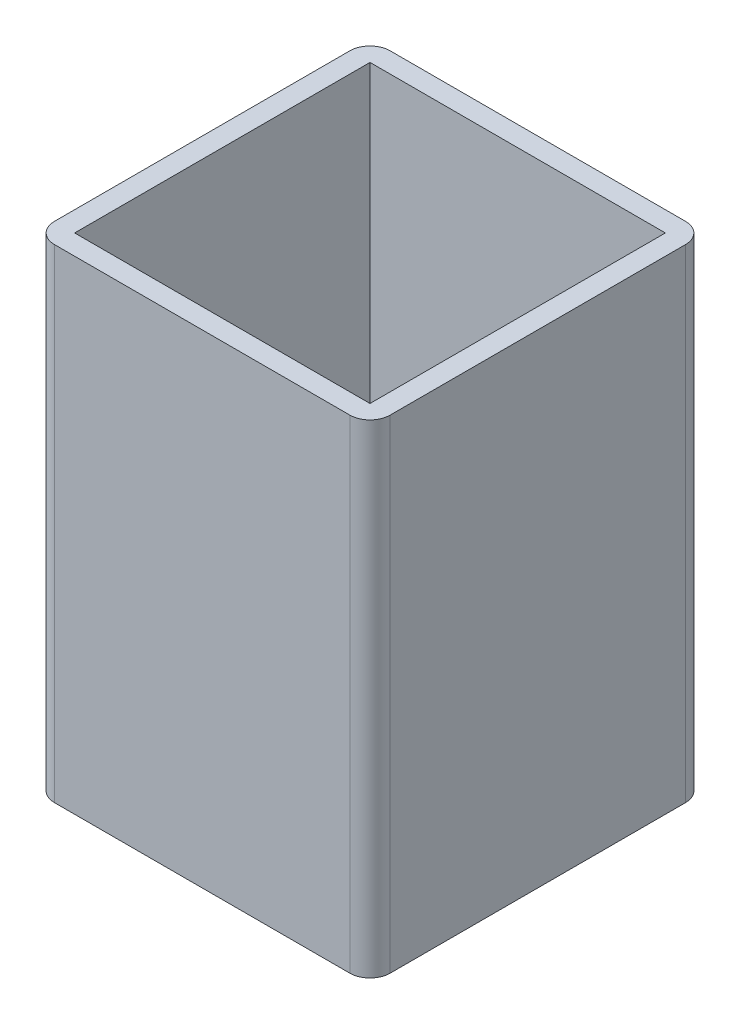
ISO-10303-21;
HEADER;
FILE_DESCRIPTION(('STEP AP214'),'2;1');
FILE_NAME('part.step','',(''),(''),'','','');
FILE_SCHEMA(('AUTOMOTIVE_DESIGN { 1 0 10303 214 1 1 1 1 }'));
ENDSEC;
DATA;
#1=APPLICATION_CONTEXT('core data for automotive mechanical design processes');
#2=APPLICATION_PROTOCOL_DEFINITION('international standard','automotive_design',2000,#1);
#3=PRODUCT_CONTEXT('',#1,'mechanical');
#4=PRODUCT('Part','Part','',(#3));
#5=PRODUCT_RELATED_PRODUCT_CATEGORY('part','',(#4));
#6=PRODUCT_DEFINITION_FORMATION('','',#4);
#7=PRODUCT_DEFINITION_CONTEXT('part definition',#1,'design');
#8=PRODUCT_DEFINITION('design','',#6,#7);
#9=PRODUCT_DEFINITION_SHAPE('','',#8);
#10=(LENGTH_UNIT() NAMED_UNIT(*) SI_UNIT(.MILLI.,.METRE.));
#11=(NAMED_UNIT(*) PLANE_ANGLE_UNIT() SI_UNIT($,.RADIAN.));
#12=(NAMED_UNIT(*) SI_UNIT($,.STERADIAN.) SOLID_ANGLE_UNIT());
#13=UNCERTAINTY_MEASURE_WITH_UNIT(LENGTH_MEASURE(1.E-05),#10,'distance_accuracy_value','');
#14=(GEOMETRIC_REPRESENTATION_CONTEXT(3) GLOBAL_UNCERTAINTY_ASSIGNED_CONTEXT((#13)) GLOBAL_UNIT_ASSIGNED_CONTEXT((#10,
#11,#12)) REPRESENTATION_CONTEXT('',''));
#15=CARTESIAN_POINT('',(0.,0.,0.));
#16=DIRECTION('',(0.,0.,1.));
#17=DIRECTION('',(1.,0.,0.));
#18=AXIS2_PLACEMENT_3D('',#15,#16,#17);
#19=CARTESIAN_POINT('',(50.,72.,50.));
#20=DIRECTION('',(0.,-1.,0.));
#21=DIRECTION('',(0.,0.,-1.));
#22=AXIS2_PLACEMENT_3D('',#19,#20,#21);
#23=PLANE('',#22);
#24=DIRECTION('',(-1.,0.,0.));
#25=VECTOR('',#24,1.);
#26=CARTESIAN_POINT('',(50.,72.,0.));
#27=LINE('',#26,#25);
#28=CARTESIAN_POINT('',(47.,72.,0.));
#29=VERTEX_POINT('',#28);
#30=CARTESIAN_POINT('',(3.,72.,0.));
#31=VERTEX_POINT('',#30);
#32=EDGE_CURVE('E172',#29,#31,#27,.T.);
#33=ORIENTED_EDGE('',*,*,#32,.T.);
#34=CARTESIAN_POINT('',(3.,72.,3.));
#35=DIRECTION('',(0.,-1.,0.));
#36=DIRECTION('',(0.,0.,-1.));
#37=AXIS2_PLACEMENT_3D('',#34,#35,#36);
#38=CIRCLE('',#37,3.);
#39=CARTESIAN_POINT('',(0.,72.,3.));
#40=VERTEX_POINT('',#39);
#41=EDGE_CURVE('E213',#31,#40,#38,.F.);
#42=ORIENTED_EDGE('',*,*,#41,.T.);
#43=DIRECTION('',(0.,0.,-1.));
#44=VECTOR('',#43,1.);
#45=CARTESIAN_POINT('',(0.,72.,50.));
#46=LINE('',#45,#44);
#47=CARTESIAN_POINT('',(0.,72.,47.));
#48=VERTEX_POINT('',#47);
#49=EDGE_CURVE('E175',#48,#40,#46,.T.);
#50=ORIENTED_EDGE('',*,*,#49,.F.);
#51=CARTESIAN_POINT('',(3.,72.,47.));
#52=DIRECTION('',(0.,-1.,0.));
#53=DIRECTION('',(0.,0.,-1.));
#54=AXIS2_PLACEMENT_3D('',#51,#52,#53);
#55=CIRCLE('',#54,3.);
#56=CARTESIAN_POINT('',(3.,72.,50.));
#57=VERTEX_POINT('',#56);
#58=EDGE_CURVE('E210',#48,#57,#55,.F.);
#59=ORIENTED_EDGE('',*,*,#58,.T.);
#60=DIRECTION('',(-1.,0.,0.));
#61=VECTOR('',#60,1.);
#62=CARTESIAN_POINT('',(50.,72.,50.));
#63=LINE('',#62,#61);
#64=CARTESIAN_POINT('',(47.,72.,50.));
#65=VERTEX_POINT('',#64);
#66=EDGE_CURVE('E171',#65,#57,#63,.T.);
#67=ORIENTED_EDGE('',*,*,#66,.F.);
#68=CARTESIAN_POINT('',(47.,72.,47.));
#69=DIRECTION('',(0.,-1.,0.));
#70=DIRECTION('',(0.,0.,-1.));
#71=AXIS2_PLACEMENT_3D('',#68,#69,#70);
#72=CIRCLE('',#71,3.);
#73=CARTESIAN_POINT('',(50.,72.,47.));
#74=VERTEX_POINT('',#73);
#75=EDGE_CURVE('E208',#65,#74,#72,.F.);
#76=ORIENTED_EDGE('',*,*,#75,.T.);
#77=DIRECTION('',(0.,0.,-1.));
#78=VECTOR('',#77,1.);
#79=CARTESIAN_POINT('',(50.,72.,50.));
#80=LINE('',#79,#78);
#81=CARTESIAN_POINT('',(50.,72.,3.));
#82=VERTEX_POINT('',#81);
#83=EDGE_CURVE('E182',#74,#82,#80,.T.);
#84=ORIENTED_EDGE('',*,*,#83,.T.);
#85=CARTESIAN_POINT('',(47.,72.,3.));
#86=DIRECTION('',(0.,-1.,0.));
#87=DIRECTION('',(0.,0.,-1.));
#88=AXIS2_PLACEMENT_3D('',#85,#86,#87);
#89=CIRCLE('',#88,3.);
#90=EDGE_CURVE('E63',#82,#29,#89,.F.);
#91=ORIENTED_EDGE('',*,*,#90,.T.);
#92=EDGE_LOOP('',(#33,#42,#50,#59,#67,#76,#84,#91));
#93=FACE_BOUND('',#92,.T.);
#94=DIRECTION('',(-1.,0.,0.));
#95=VECTOR('',#94,1.);
#96=CARTESIAN_POINT('',(50.,72.,3.));
#97=LINE('',#96,#95);
#98=CARTESIAN_POINT('',(47.,72.,3.));
#99=VERTEX_POINT('',#98);
#100=CARTESIAN_POINT('',(3.,72.,3.));
#101=VERTEX_POINT('',#100);
#102=EDGE_CURVE('E151',#99,#101,#97,.T.);
#103=ORIENTED_EDGE('',*,*,#102,.F.);
#104=DIRECTION('',(0.,0.,-1.));
#105=VECTOR('',#104,1.);
#106=CARTESIAN_POINT('',(47.,72.,50.));
#107=LINE('',#106,#105);
#108=CARTESIAN_POINT('',(47.,72.,47.));
#109=VERTEX_POINT('',#108);
#110=EDGE_CURVE('E164',#109,#99,#107,.T.);
#111=ORIENTED_EDGE('',*,*,#110,.F.);
#112=DIRECTION('',(-1.,0.,0.));
#113=VECTOR('',#112,1.);
#114=CARTESIAN_POINT('',(50.,72.,47.));
#115=LINE('',#114,#113);
#116=CARTESIAN_POINT('',(3.,72.,47.));
#117=VERTEX_POINT('',#116);
#118=EDGE_CURVE('E55',#109,#117,#115,.T.);
#119=ORIENTED_EDGE('',*,*,#118,.T.);
#120=DIRECTION('',(0.,0.,-1.));
#121=VECTOR('',#120,1.);
#122=CARTESIAN_POINT('',(3.,72.,50.));
#123=LINE('',#122,#121);
#124=EDGE_CURVE('E145',#117,#101,#123,.T.);
#125=ORIENTED_EDGE('',*,*,#124,.T.);
#126=EDGE_LOOP('',(#103,#111,#119,#125));
#127=FACE_BOUND('',#126,.T.);
#128=ADVANCED_FACE('F39',(#93,#127),#23,.F.);
#129=CARTESIAN_POINT('',(0.,72.,50.));
#130=DIRECTION('',(1.,0.,0.));
#131=DIRECTION('',(0.,0.,-1.));
#132=AXIS2_PLACEMENT_3D('',#129,#130,#131);
#133=PLANE('',#132);
#134=ORIENTED_EDGE('',*,*,#49,.T.);
#135=DIRECTION('',(0.,-1.,0.));
#136=VECTOR('',#135,1.);
#137=CARTESIAN_POINT('',(0.,72.,3.));
#138=LINE('',#137,#136);
#139=CARTESIAN_POINT('',(0.,0.,3.));
#140=VERTEX_POINT('',#139);
#141=EDGE_CURVE('E193',#40,#140,#138,.T.);
#142=ORIENTED_EDGE('',*,*,#141,.T.);
#143=DIRECTION('',(0.,0.,-1.));
#144=VECTOR('',#143,1.);
#145=CARTESIAN_POINT('',(0.,0.,50.));
#146=LINE('',#145,#144);
#147=CARTESIAN_POINT('',(0.,0.,47.));
#148=VERTEX_POINT('',#147);
#149=EDGE_CURVE('E188',#148,#140,#146,.T.);
#150=ORIENTED_EDGE('',*,*,#149,.F.);
#151=DIRECTION('',(0.,-1.,0.));
#152=VECTOR('',#151,1.);
#153=CARTESIAN_POINT('',(0.,72.,47.));
#154=LINE('',#153,#152);
#155=EDGE_CURVE('E191',#148,#48,#154,.F.);
#156=ORIENTED_EDGE('',*,*,#155,.T.);
#157=EDGE_LOOP('',(#134,#142,#150,#156));
#158=FACE_BOUND('',#157,.T.);
#159=ADVANCED_FACE('F255',(#158),#133,.F.);
#160=CARTESIAN_POINT('',(0.,0.,50.));
#161=DIRECTION('',(0.,1.,0.));
#162=DIRECTION('',(0.,0.,1.));
#163=AXIS2_PLACEMENT_3D('',#160,#161,#162);
#164=PLANE('',#163);
#165=CARTESIAN_POINT('',(25.,0.,25.));
#166=DIRECTION('',(0.,-1.,0.));
#167=DIRECTION('',(0.,0.,-1.));
#168=AXIS2_PLACEMENT_3D('',#165,#166,#167);
#169=CIRCLE('',#168,12.);
#170=CARTESIAN_POINT('',(25.,0.,13.));
#171=VERTEX_POINT('',#170);
#172=EDGE_CURVE('E400',#171,#171,#169,.T.);
#173=ORIENTED_EDGE('',*,*,#172,.F.);
#174=EDGE_LOOP('',(#173));
#175=FACE_BOUND('',#174,.T.);
#176=ORIENTED_EDGE('',*,*,#149,.T.);
#177=CARTESIAN_POINT('',(3.,0.,3.));
#178=DIRECTION('',(0.,1.,0.));
#179=DIRECTION('',(0.,0.,1.));
#180=AXIS2_PLACEMENT_3D('',#177,#178,#179);
#181=CIRCLE('',#180,3.);
#182=CARTESIAN_POINT('',(3.,0.,0.));
#183=VERTEX_POINT('',#182);
#184=EDGE_CURVE('E202',#140,#183,#181,.F.);
#185=ORIENTED_EDGE('',*,*,#184,.T.);
#186=DIRECTION('',(1.,0.,0.));
#187=VECTOR('',#186,1.);
#188=CARTESIAN_POINT('',(0.,0.,0.));
#189=LINE('',#188,#187);
#190=CARTESIAN_POINT('',(47.,0.,0.));
#191=VERTEX_POINT('',#190);
#192=EDGE_CURVE('E163',#183,#191,#189,.T.);
#193=ORIENTED_EDGE('',*,*,#192,.T.);
#194=CARTESIAN_POINT('',(47.,0.,3.));
#195=DIRECTION('',(0.,1.,0.));
#196=DIRECTION('',(0.,0.,1.));
#197=AXIS2_PLACEMENT_3D('',#194,#195,#196);
#198=CIRCLE('',#197,3.);
#199=CARTESIAN_POINT('',(50.,0.,3.));
#200=VERTEX_POINT('',#199);
#201=EDGE_CURVE('E200',#191,#200,#198,.F.);
#202=ORIENTED_EDGE('',*,*,#201,.T.);
#203=DIRECTION('',(0.,0.,-1.));
#204=VECTOR('',#203,1.);
#205=CARTESIAN_POINT('',(50.,0.,50.));
#206=LINE('',#205,#204);
#207=CARTESIAN_POINT('',(50.,0.,47.));
#208=VERTEX_POINT('',#207);
#209=EDGE_CURVE('E185',#208,#200,#206,.T.);
#210=ORIENTED_EDGE('',*,*,#209,.F.);
#211=CARTESIAN_POINT('',(47.,0.,47.));
#212=DIRECTION('',(0.,1.,0.));
#213=DIRECTION('',(0.,0.,1.));
#214=AXIS2_PLACEMENT_3D('',#211,#212,#213);
#215=CIRCLE('',#214,3.);
#216=CARTESIAN_POINT('',(47.,0.,50.));
#217=VERTEX_POINT('',#216);
#218=EDGE_CURVE('E196',#208,#217,#215,.F.);
#219=ORIENTED_EDGE('',*,*,#218,.T.);
#220=DIRECTION('',(1.,0.,0.));
#221=VECTOR('',#220,1.);
#222=CARTESIAN_POINT('',(0.,0.,50.));
#223=LINE('',#222,#221);
#224=CARTESIAN_POINT('',(3.,0.,50.));
#225=VERTEX_POINT('',#224);
#226=EDGE_CURVE('E168',#225,#217,#223,.T.);
#227=ORIENTED_EDGE('',*,*,#226,.F.);
#228=CARTESIAN_POINT('',(3.,0.,47.));
#229=DIRECTION('',(0.,1.,0.));
#230=DIRECTION('',(0.,0.,1.));
#231=AXIS2_PLACEMENT_3D('',#228,#229,#230);
#232=CIRCLE('',#231,3.);
#233=EDGE_CURVE('E198',#225,#148,#232,.F.);
#234=ORIENTED_EDGE('',*,*,#233,.T.);
#235=EDGE_LOOP('',(#176,#185,#193,#202,#210,#219,#227,#234));
#236=FACE_BOUND('',#235,.T.);
#237=ADVANCED_FACE('F237',(#175,#236),#164,.F.);
#238=CARTESIAN_POINT('',(50.,0.,50.));
#239=DIRECTION('',(-1.,0.,0.));
#240=DIRECTION('',(0.,0.,1.));
#241=AXIS2_PLACEMENT_3D('',#238,#239,#240);
#242=PLANE('',#241);
#243=ORIENTED_EDGE('',*,*,#209,.T.);
#244=DIRECTION('',(0.,1.,0.));
#245=VECTOR('',#244,1.);
#246=CARTESIAN_POINT('',(50.,0.,3.));
#247=LINE('',#246,#245);
#248=EDGE_CURVE('E217',#200,#82,#247,.T.);
#249=ORIENTED_EDGE('',*,*,#248,.T.);
#250=ORIENTED_EDGE('',*,*,#83,.F.);
#251=DIRECTION('',(0.,1.,0.));
#252=VECTOR('',#251,1.);
#253=CARTESIAN_POINT('',(50.,0.,47.));
#254=LINE('',#253,#252);
#255=EDGE_CURVE('E215',#74,#208,#254,.F.);
#256=ORIENTED_EDGE('',*,*,#255,.T.);
#257=EDGE_LOOP('',(#243,#249,#250,#256));
#258=FACE_BOUND('',#257,.T.);
#259=ADVANCED_FACE('F242',(#258),#242,.F.);
#260=CARTESIAN_POINT('',(0.,0.,50.));
#261=DIRECTION('',(0.,0.,1.));
#262=DIRECTION('',(1.,0.,0.));
#263=AXIS2_PLACEMENT_3D('',#260,#261,#262);
#264=PLANE('',#263);
#265=ORIENTED_EDGE('',*,*,#66,.T.);
#266=DIRECTION('',(0.,-1.,0.));
#267=VECTOR('',#266,1.);
#268=CARTESIAN_POINT('',(3.,0.,50.));
#269=LINE('',#268,#267);
#270=EDGE_CURVE('E11',#57,#225,#269,.T.);
#271=ORIENTED_EDGE('',*,*,#270,.T.);
#272=ORIENTED_EDGE('',*,*,#226,.T.);
#273=DIRECTION('',(0.,1.,0.));
#274=VECTOR('',#273,1.);
#275=CARTESIAN_POINT('',(47.,72.,50.));
#276=LINE('',#275,#274);
#277=EDGE_CURVE('E48',#217,#65,#276,.T.);
#278=ORIENTED_EDGE('',*,*,#277,.T.);
#279=EDGE_LOOP('',(#265,#271,#272,#278));
#280=FACE_BOUND('',#279,.T.);
#281=ADVANCED_FACE('F223',(#280),#264,.T.);
#282=CARTESIAN_POINT('',(0.,0.,0.));
#283=DIRECTION('',(0.,0.,1.));
#284=DIRECTION('',(1.,0.,0.));
#285=AXIS2_PLACEMENT_3D('',#282,#283,#284);
#286=PLANE('',#285);
#287=ORIENTED_EDGE('',*,*,#192,.F.);
#288=DIRECTION('',(0.,-1.,0.));
#289=VECTOR('',#288,1.);
#290=CARTESIAN_POINT('',(3.,0.,0.));
#291=LINE('',#290,#289);
#292=EDGE_CURVE('E206',#183,#31,#291,.F.);
#293=ORIENTED_EDGE('',*,*,#292,.T.);
#294=ORIENTED_EDGE('',*,*,#32,.F.);
#295=DIRECTION('',(0.,1.,0.));
#296=VECTOR('',#295,1.);
#297=CARTESIAN_POINT('',(47.,0.,0.));
#298=LINE('',#297,#296);
#299=EDGE_CURVE('E204',#29,#191,#298,.F.);
#300=ORIENTED_EDGE('',*,*,#299,.T.);
#301=EDGE_LOOP('',(#287,#293,#294,#300));
#302=FACE_BOUND('',#301,.T.);
#303=ADVANCED_FACE('F247',(#302),#286,.F.);
#304=CARTESIAN_POINT('',(3.,72.,3.));
#305=DIRECTION('',(0.,-1.,0.));
#306=DIRECTION('',(0.,0.,-1.));
#307=AXIS2_PLACEMENT_3D('',#304,#305,#306);
#308=CYLINDRICAL_SURFACE('',#307,3.);
#309=ORIENTED_EDGE('',*,*,#41,.F.);
#310=ORIENTED_EDGE('',*,*,#292,.F.);
#311=ORIENTED_EDGE('',*,*,#184,.F.);
#312=ORIENTED_EDGE('',*,*,#141,.F.);
#313=EDGE_LOOP('',(#309,#310,#311,#312));
#314=FACE_BOUND('',#313,.T.);
#315=ADVANCED_FACE('F252',(#314),#308,.T.);
#316=CARTESIAN_POINT('',(47.,0.,3.));
#317=DIRECTION('',(0.,1.,0.));
#318=DIRECTION('',(0.,0.,1.));
#319=AXIS2_PLACEMENT_3D('',#316,#317,#318);
#320=CYLINDRICAL_SURFACE('',#319,3.);
#321=ORIENTED_EDGE('',*,*,#201,.F.);
#322=ORIENTED_EDGE('',*,*,#299,.F.);
#323=ORIENTED_EDGE('',*,*,#90,.F.);
#324=ORIENTED_EDGE('',*,*,#248,.F.);
#325=EDGE_LOOP('',(#321,#322,#323,#324));
#326=FACE_BOUND('',#325,.T.);
#327=ADVANCED_FACE('F250',(#326),#320,.T.);
#328=CARTESIAN_POINT('',(3.,0.,47.));
#329=DIRECTION('',(0.,1.,0.));
#330=DIRECTION('',(0.,0.,1.));
#331=AXIS2_PLACEMENT_3D('',#328,#329,#330);
#332=CYLINDRICAL_SURFACE('',#331,3.);
#333=ORIENTED_EDGE('',*,*,#58,.F.);
#334=ORIENTED_EDGE('',*,*,#155,.F.);
#335=ORIENTED_EDGE('',*,*,#233,.F.);
#336=ORIENTED_EDGE('',*,*,#270,.F.);
#337=EDGE_LOOP('',(#333,#334,#335,#336));
#338=FACE_BOUND('',#337,.T.);
#339=ADVANCED_FACE('F235',(#338),#332,.T.);
#340=CARTESIAN_POINT('',(47.,0.,47.));
#341=DIRECTION('',(0.,-1.,0.));
#342=DIRECTION('',(0.,0.,-1.));
#343=AXIS2_PLACEMENT_3D('',#340,#341,#342);
#344=CYLINDRICAL_SURFACE('',#343,3.);
#345=ORIENTED_EDGE('',*,*,#218,.F.);
#346=ORIENTED_EDGE('',*,*,#255,.F.);
#347=ORIENTED_EDGE('',*,*,#75,.F.);
#348=ORIENTED_EDGE('',*,*,#277,.F.);
#349=EDGE_LOOP('',(#345,#346,#347,#348));
#350=FACE_BOUND('',#349,.T.);
#351=ADVANCED_FACE('F41',(#350),#344,.T.);
#352=CARTESIAN_POINT('',(3.,72.,50.));
#353=DIRECTION('',(1.,0.,0.));
#354=DIRECTION('',(0.,0.,-1.));
#355=AXIS2_PLACEMENT_3D('',#352,#353,#354);
#356=PLANE('',#355);
#357=ORIENTED_EDGE('',*,*,#124,.F.);
#358=DIRECTION('',(0.,1.,0.));
#359=VECTOR('',#358,1.);
#360=CARTESIAN_POINT('',(3.,0.,47.));
#361=LINE('',#360,#359);
#362=CARTESIAN_POINT('',(3.,3.,47.));
#363=VERTEX_POINT('',#362);
#364=EDGE_CURVE('E139',#363,#117,#361,.T.);
#365=ORIENTED_EDGE('',*,*,#364,.F.);
#366=DIRECTION('',(0.,0.,-1.));
#367=VECTOR('',#366,1.);
#368=CARTESIAN_POINT('',(3.,3.,50.));
#369=LINE('',#368,#367);
#370=CARTESIAN_POINT('',(3.,3.,3.));
#371=VERTEX_POINT('',#370);
#372=EDGE_CURVE('E130',#363,#371,#369,.T.);
#373=ORIENTED_EDGE('',*,*,#372,.T.);
#374=DIRECTION('',(0.,1.,0.));
#375=VECTOR('',#374,1.);
#376=CARTESIAN_POINT('',(3.,0.,3.));
#377=LINE('',#376,#375);
#378=EDGE_CURVE('E161',#371,#101,#377,.T.);
#379=ORIENTED_EDGE('',*,*,#378,.T.);
#380=EDGE_LOOP('',(#357,#365,#373,#379));
#381=FACE_BOUND('',#380,.T.);
#382=ADVANCED_FACE('F143',(#381),#356,.T.);
#383=CARTESIAN_POINT('',(0.,3.,50.));
#384=DIRECTION('',(0.,1.,0.));
#385=DIRECTION('',(0.,0.,1.));
#386=AXIS2_PLACEMENT_3D('',#383,#384,#385);
#387=PLANE('',#386);
#388=CARTESIAN_POINT('',(25.,3.,25.));
#389=DIRECTION('',(0.,1.,0.));
#390=DIRECTION('',(0.,0.,1.));
#391=AXIS2_PLACEMENT_3D('',#388,#389,#390);
#392=CIRCLE('',#391,12.);
#393=CARTESIAN_POINT('',(25.,3.,13.));
#394=VERTEX_POINT('',#393);
#395=EDGE_CURVE('E43',#394,#394,#392,.T.);
#396=ORIENTED_EDGE('',*,*,#395,.F.);
#397=EDGE_LOOP('',(#396));
#398=FACE_BOUND('',#397,.T.);
#399=ORIENTED_EDGE('',*,*,#372,.F.);
#400=DIRECTION('',(1.,0.,0.));
#401=VECTOR('',#400,1.);
#402=CARTESIAN_POINT('',(0.,3.,47.));
#403=LINE('',#402,#401);
#404=CARTESIAN_POINT('',(47.,3.,47.));
#405=VERTEX_POINT('',#404);
#406=EDGE_CURVE('E134',#363,#405,#403,.T.);
#407=ORIENTED_EDGE('',*,*,#406,.T.);
#408=DIRECTION('',(0.,0.,-1.));
#409=VECTOR('',#408,1.);
#410=CARTESIAN_POINT('',(47.,3.,50.));
#411=LINE('',#410,#409);
#412=CARTESIAN_POINT('',(47.,3.,3.));
#413=VERTEX_POINT('',#412);
#414=EDGE_CURVE('E140',#405,#413,#411,.T.);
#415=ORIENTED_EDGE('',*,*,#414,.T.);
#416=DIRECTION('',(1.,0.,0.));
#417=VECTOR('',#416,1.);
#418=CARTESIAN_POINT('',(0.,3.,3.));
#419=LINE('',#418,#417);
#420=EDGE_CURVE('E136',#371,#413,#419,.T.);
#421=ORIENTED_EDGE('',*,*,#420,.F.);
#422=EDGE_LOOP('',(#399,#407,#415,#421));
#423=FACE_BOUND('',#422,.T.);
#424=ADVANCED_FACE('F132',(#398,#423),#387,.T.);
#425=CARTESIAN_POINT('',(47.,0.,50.));
#426=DIRECTION('',(-1.,0.,0.));
#427=DIRECTION('',(0.,0.,1.));
#428=AXIS2_PLACEMENT_3D('',#425,#426,#427);
#429=PLANE('',#428);
#430=ORIENTED_EDGE('',*,*,#414,.F.);
#431=DIRECTION('',(0.,-1.,0.));
#432=VECTOR('',#431,1.);
#433=CARTESIAN_POINT('',(47.,0.,47.));
#434=LINE('',#433,#432);
#435=EDGE_CURVE('E149',#109,#405,#434,.T.);
#436=ORIENTED_EDGE('',*,*,#435,.F.);
#437=ORIENTED_EDGE('',*,*,#110,.T.);
#438=DIRECTION('',(0.,-1.,0.));
#439=VECTOR('',#438,1.);
#440=CARTESIAN_POINT('',(47.,0.,3.));
#441=LINE('',#440,#439);
#442=EDGE_CURVE('E146',#99,#413,#441,.T.);
#443=ORIENTED_EDGE('',*,*,#442,.T.);
#444=EDGE_LOOP('',(#430,#436,#437,#443));
#445=FACE_BOUND('',#444,.T.);
#446=ADVANCED_FACE('F281',(#445),#429,.T.);
#447=CARTESIAN_POINT('',(0.,0.,47.));
#448=DIRECTION('',(0.,0.,1.));
#449=DIRECTION('',(1.,0.,0.));
#450=AXIS2_PLACEMENT_3D('',#447,#448,#449);
#451=PLANE('',#450);
#452=ORIENTED_EDGE('',*,*,#118,.F.);
#453=ORIENTED_EDGE('',*,*,#435,.T.);
#454=ORIENTED_EDGE('',*,*,#406,.F.);
#455=ORIENTED_EDGE('',*,*,#364,.T.);
#456=EDGE_LOOP('',(#452,#453,#454,#455));
#457=FACE_BOUND('',#456,.T.);
#458=ADVANCED_FACE('F148',(#457),#451,.F.);
#459=CARTESIAN_POINT('',(0.,0.,3.));
#460=DIRECTION('',(0.,0.,1.));
#461=DIRECTION('',(1.,0.,0.));
#462=AXIS2_PLACEMENT_3D('',#459,#460,#461);
#463=PLANE('',#462);
#464=ORIENTED_EDGE('',*,*,#420,.T.);
#465=ORIENTED_EDGE('',*,*,#442,.F.);
#466=ORIENTED_EDGE('',*,*,#102,.T.);
#467=ORIENTED_EDGE('',*,*,#378,.F.);
#468=EDGE_LOOP('',(#464,#465,#466,#467));
#469=FACE_BOUND('',#468,.T.);
#470=ADVANCED_FACE('F292',(#469),#463,.T.);
#471=CARTESIAN_POINT('',(25.,3.1,25.));
#472=DIRECTION('',(0.,-1.,0.));
#473=DIRECTION('',(0.,0.,-1.));
#474=AXIS2_PLACEMENT_3D('',#471,#472,#473);
#475=CYLINDRICAL_SURFACE('',#474,12.);
#476=CARTESIAN_POINT('',(25.,3.,13.));
#477=CARTESIAN_POINT('',(25.,2.96875,13.));
#478=CARTESIAN_POINT('',(25.,2.9375,13.));
#479=CARTESIAN_POINT('',(25.,2.875,13.));
#480=CARTESIAN_POINT('',(25.,2.84375,13.));
#481=CARTESIAN_POINT('',(25.,2.78125,13.));
#482=CARTESIAN_POINT('',(25.,2.75,13.));
#483=CARTESIAN_POINT('',(25.,2.6875,13.));
#484=CARTESIAN_POINT('',(25.,2.65625,13.));
#485=CARTESIAN_POINT('',(25.,2.59375,13.));
#486=CARTESIAN_POINT('',(25.,2.5625,13.));
#487=CARTESIAN_POINT('',(25.,2.5,13.));
#488=CARTESIAN_POINT('',(25.,2.46875,13.));
#489=CARTESIAN_POINT('',(25.,2.40625,13.));
#490=CARTESIAN_POINT('',(25.,2.375,13.));
#491=CARTESIAN_POINT('',(25.,2.3125,13.));
#492=CARTESIAN_POINT('',(25.,2.28125,13.));
#493=CARTESIAN_POINT('',(25.,2.21875,13.));
#494=CARTESIAN_POINT('',(25.,2.1875,13.));
#495=CARTESIAN_POINT('',(25.,2.125,13.));
#496=CARTESIAN_POINT('',(25.,2.09375,13.));
#497=CARTESIAN_POINT('',(25.,2.03125,13.));
#498=CARTESIAN_POINT('',(25.,2.,13.));
#499=CARTESIAN_POINT('',(25.,1.9375,13.));
#500=CARTESIAN_POINT('',(25.,1.90625,13.));
#501=CARTESIAN_POINT('',(25.,1.84375,13.));
#502=CARTESIAN_POINT('',(25.,1.8125,13.));
#503=CARTESIAN_POINT('',(25.,1.75,13.));
#504=CARTESIAN_POINT('',(25.,1.71875,13.));
#505=CARTESIAN_POINT('',(25.,1.65625,13.));
#506=CARTESIAN_POINT('',(25.,1.625,13.));
#507=CARTESIAN_POINT('',(25.,1.5625,13.));
#508=CARTESIAN_POINT('',(25.,1.53125,13.));
#509=CARTESIAN_POINT('',(25.,1.46875,13.));
#510=CARTESIAN_POINT('',(25.,1.4375,13.));
#511=CARTESIAN_POINT('',(25.,1.375,13.));
#512=CARTESIAN_POINT('',(25.,1.34375,13.));
#513=CARTESIAN_POINT('',(25.,1.28125,13.));
#514=CARTESIAN_POINT('',(25.,1.25,13.));
#515=CARTESIAN_POINT('',(25.,1.1875,13.));
#516=CARTESIAN_POINT('',(25.,1.15625,13.));
#517=CARTESIAN_POINT('',(25.,1.09375,13.));
#518=CARTESIAN_POINT('',(25.,1.0625,13.));
#519=CARTESIAN_POINT('',(25.,1.,13.));
#520=CARTESIAN_POINT('',(25.,0.96875,13.));
#521=CARTESIAN_POINT('',(25.,0.90625,13.));
#522=CARTESIAN_POINT('',(25.,0.875,13.));
#523=CARTESIAN_POINT('',(25.,0.8125,13.));
#524=CARTESIAN_POINT('',(25.,0.78125,13.));
#525=CARTESIAN_POINT('',(25.,0.71875,13.));
#526=CARTESIAN_POINT('',(25.,0.6875,13.));
#527=CARTESIAN_POINT('',(25.,0.625,13.));
#528=CARTESIAN_POINT('',(25.,0.59375,13.));
#529=CARTESIAN_POINT('',(25.,0.53125,13.));
#530=CARTESIAN_POINT('',(25.,0.5,13.));
#531=CARTESIAN_POINT('',(25.,0.4375,13.));
#532=CARTESIAN_POINT('',(25.,0.40625,13.));
#533=CARTESIAN_POINT('',(25.,0.34375,13.));
#534=CARTESIAN_POINT('',(25.,0.3125,13.));
#535=CARTESIAN_POINT('',(25.,0.25,13.));
#536=CARTESIAN_POINT('',(25.,0.21875,13.));
#537=CARTESIAN_POINT('',(25.,0.15625,13.));
#538=CARTESIAN_POINT('',(25.,0.125,13.));
#539=CARTESIAN_POINT('',(25.,0.0625000000000001,13.));
#540=CARTESIAN_POINT('',(25.,0.03125,13.));
#541=CARTESIAN_POINT('',(25.,0.,13.));
#542=B_SPLINE_CURVE_WITH_KNOTS('',3,(#476,#477,#478,#479,#480,#481,#482,#483,#484,#485,#486,
#487,#488,#489,#490,#491,#492,#493,#494,#495,#496,#497,#498,#499,#500,#501,#502,#503,#504,#505,
#506,#507,#508,#509,#510,#511,#512,#513,#514,#515,#516,#517,#518,#519,#520,#521,#522,#523,#524,
#525,#526,#527,#528,#529,#530,#531,#532,#533,#534,#535,#536,#537,#538,#539,#540,#541),
.UNSPECIFIED.,.F.,.F.,(4,2,2,2,2,2,2,2,2,2,2,2,2,2,2,2,2,2,2,2,2,2,2,2,2,2,2,2,2,2,2,2,4),(0.,
0.0937499999999997,0.1875,0.28125,0.375,0.46875,0.5625,0.65625,0.75,0.843749999999999,0.9375,
1.03125,1.125,1.21875,1.3125,1.40625,1.5,1.59375,1.6875,1.78125,1.875,1.96875,2.0625,2.15625,
2.25,2.34375,2.4375,2.53125,2.625,2.71875,2.8125,2.90625,3.),.UNSPECIFIED.);
#543=EDGE_CURVE('BSEAM285',#394,#171,#542,.T.);
#544=ORIENTED_EDGE('',*,*,#395,.T.);
#545=ORIENTED_EDGE('',*,*,#172,.T.);
#546=ORIENTED_EDGE('',*,*,#543,.T.);
#547=ORIENTED_EDGE('',*,*,#543,.F.);
#548=EDGE_LOOP('',(#544,#546,#545,#547));
#549=FACE_BOUND('',#548,.T.);
#550=ADVANCED_FACE('F285',(#549),#475,.F.);
#551=CLOSED_SHELL('',(#128,#159,#237,#259,#281,#303,#315,#327,#339,#351,#382,#424,#446,#458,
#470,#550));
#552=MANIFOLD_SOLID_BREP('B2',#551);
#553=ADVANCED_BREP_SHAPE_REPRESENTATION('',(#18,#552),#14);
#554=SHAPE_DEFINITION_REPRESENTATION(#9,#553);
ENDSEC;
END-ISO-10303-21;
